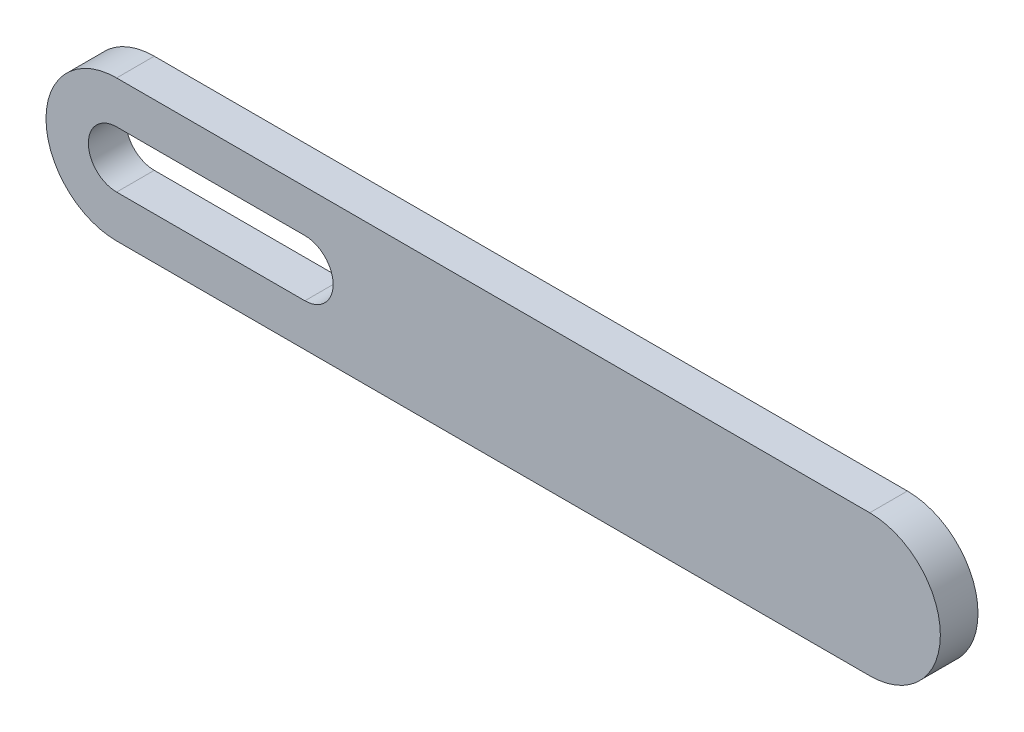
ISO-10303-21;
HEADER;
FILE_DESCRIPTION(('STEP AP214'),'2;1');
FILE_NAME('part.step','',(''),(''),'','','');
FILE_SCHEMA(('AUTOMOTIVE_DESIGN { 1 0 10303 214 1 1 1 1 }'));
ENDSEC;
DATA;
#1=APPLICATION_CONTEXT('core data for automotive mechanical design processes');
#2=APPLICATION_PROTOCOL_DEFINITION('international standard','automotive_design',2000,#1);
#3=PRODUCT_CONTEXT('',#1,'mechanical');
#4=PRODUCT('Part','Part','',(#3));
#5=PRODUCT_RELATED_PRODUCT_CATEGORY('part','',(#4));
#6=PRODUCT_DEFINITION_FORMATION('','',#4);
#7=PRODUCT_DEFINITION_CONTEXT('part definition',#1,'design');
#8=PRODUCT_DEFINITION('design','',#6,#7);
#9=PRODUCT_DEFINITION_SHAPE('','',#8);
#10=(LENGTH_UNIT() NAMED_UNIT(*) SI_UNIT(.MILLI.,.METRE.));
#11=(NAMED_UNIT(*) PLANE_ANGLE_UNIT() SI_UNIT($,.RADIAN.));
#12=(NAMED_UNIT(*) SI_UNIT($,.STERADIAN.) SOLID_ANGLE_UNIT());
#13=UNCERTAINTY_MEASURE_WITH_UNIT(LENGTH_MEASURE(1.E-05),#10,'distance_accuracy_value','');
#14=(GEOMETRIC_REPRESENTATION_CONTEXT(3) GLOBAL_UNCERTAINTY_ASSIGNED_CONTEXT((#13)) GLOBAL_UNIT_ASSIGNED_CONTEXT((#10,
#11,#12)) REPRESENTATION_CONTEXT('',''));
#15=CARTESIAN_POINT('',(0.,0.,0.));
#16=DIRECTION('',(0.,0.,1.));
#17=DIRECTION('',(1.,0.,0.));
#18=AXIS2_PLACEMENT_3D('',#15,#16,#17);
#19=CARTESIAN_POINT('',(-200.,0.,20.));
#20=DIRECTION('',(0.,0.,1.));
#21=DIRECTION('',(1.,0.,0.));
#22=AXIS2_PLACEMENT_3D('',#19,#20,#21);
#23=PLANE('',#22);
#24=CARTESIAN_POINT('',(-200.,0.,20.));
#25=DIRECTION('',(0.,0.,1.));
#26=DIRECTION('',(1.,0.,0.));
#27=AXIS2_PLACEMENT_3D('',#24,#25,#26);
#28=CIRCLE('',#27,37.5);
#29=CARTESIAN_POINT('',(-200.,37.5,20.));
#30=VERTEX_POINT('',#29);
#31=CARTESIAN_POINT('',(-200.,-37.5,20.));
#32=VERTEX_POINT('',#31);
#33=EDGE_CURVE('E138',#30,#32,#28,.T.);
#34=ORIENTED_EDGE('',*,*,#33,.T.);
#35=DIRECTION('',(1.,0.,0.));
#36=VECTOR('',#35,1.);
#37=CARTESIAN_POINT('',(-200.,-37.5,20.));
#38=LINE('',#37,#36);
#39=CARTESIAN_POINT('',(200.,-37.5,20.));
#40=VERTEX_POINT('',#39);
#41=EDGE_CURVE('E141',#32,#40,#38,.T.);
#42=ORIENTED_EDGE('',*,*,#41,.T.);
#43=CARTESIAN_POINT('',(200.,0.,20.));
#44=DIRECTION('',(0.,0.,1.));
#45=DIRECTION('',(1.,0.,0.));
#46=AXIS2_PLACEMENT_3D('',#43,#44,#45);
#47=CIRCLE('',#46,37.5);
#48=CARTESIAN_POINT('',(200.,37.5,20.));
#49=VERTEX_POINT('',#48);
#50=EDGE_CURVE('E144',#40,#49,#47,.T.);
#51=ORIENTED_EDGE('',*,*,#50,.T.);
#52=DIRECTION('',(-1.,0.,0.));
#53=VECTOR('',#52,1.);
#54=CARTESIAN_POINT('',(-200.,37.5,20.));
#55=LINE('',#54,#53);
#56=EDGE_CURVE('E146',#49,#30,#55,.T.);
#57=ORIENTED_EDGE('',*,*,#56,.T.);
#58=EDGE_LOOP('',(#34,#42,#51,#57));
#59=FACE_BOUND('',#58,.T.);
#60=DIRECTION('',(1.,0.,0.));
#61=VECTOR('',#60,1.);
#62=CARTESIAN_POINT('',(-200.,-15.,20.));
#63=LINE('',#62,#61);
#64=CARTESIAN_POINT('',(-200.,-15.,20.));
#65=VERTEX_POINT('',#64);
#66=CARTESIAN_POINT('',(-99.9999999999999,-15.,20.));
#67=VERTEX_POINT('',#66);
#68=EDGE_CURVE('E110',#65,#67,#63,.T.);
#69=ORIENTED_EDGE('',*,*,#68,.F.);
#70=CARTESIAN_POINT('',(-200.,0.,20.));
#71=DIRECTION('',(0.,0.,1.));
#72=DIRECTION('',(1.,0.,0.));
#73=AXIS2_PLACEMENT_3D('',#70,#71,#72);
#74=CIRCLE('',#73,15.);
#75=CARTESIAN_POINT('',(-200.,15.,20.));
#76=VERTEX_POINT('',#75);
#77=EDGE_CURVE('E102',#76,#65,#74,.T.);
#78=ORIENTED_EDGE('',*,*,#77,.F.);
#79=DIRECTION('',(-1.,0.,0.));
#80=VECTOR('',#79,1.);
#81=CARTESIAN_POINT('',(-200.,15.,20.));
#82=LINE('',#81,#80);
#83=CARTESIAN_POINT('',(-99.9999999999999,15.,20.));
#84=VERTEX_POINT('',#83);
#85=EDGE_CURVE('E124',#84,#76,#82,.T.);
#86=ORIENTED_EDGE('',*,*,#85,.F.);
#87=CARTESIAN_POINT('',(-99.9999999999999,0.,20.));
#88=DIRECTION('',(0.,0.,1.));
#89=DIRECTION('',(1.,0.,0.));
#90=AXIS2_PLACEMENT_3D('',#87,#88,#89);
#91=CIRCLE('',#90,15.);
#92=EDGE_CURVE('E122',#67,#84,#91,.T.);
#93=ORIENTED_EDGE('',*,*,#92,.F.);
#94=EDGE_LOOP('',(#69,#78,#86,#93));
#95=FACE_BOUND('',#94,.T.);
#96=ADVANCED_FACE('F37',(#59,#95),#23,.T.);
#97=CARTESIAN_POINT('',(-200.,0.,0.));
#98=DIRECTION('',(0.,0.,1.));
#99=DIRECTION('',(1.,0.,0.));
#100=AXIS2_PLACEMENT_3D('',#97,#98,#99);
#101=PLANE('',#100);
#102=CARTESIAN_POINT('',(-200.,0.,0.));
#103=DIRECTION('',(0.,0.,1.));
#104=DIRECTION('',(1.,0.,0.));
#105=AXIS2_PLACEMENT_3D('',#102,#103,#104);
#106=CIRCLE('',#105,37.5);
#107=CARTESIAN_POINT('',(-200.,37.5,0.));
#108=VERTEX_POINT('',#107);
#109=CARTESIAN_POINT('',(-200.,-37.5,0.));
#110=VERTEX_POINT('',#109);
#111=EDGE_CURVE('E118',#108,#110,#106,.T.);
#112=ORIENTED_EDGE('',*,*,#111,.F.);
#113=DIRECTION('',(-1.,0.,0.));
#114=VECTOR('',#113,1.);
#115=CARTESIAN_POINT('',(-200.,37.5,0.));
#116=LINE('',#115,#114);
#117=CARTESIAN_POINT('',(200.,37.5,0.));
#118=VERTEX_POINT('',#117);
#119=EDGE_CURVE('E142',#118,#108,#116,.T.);
#120=ORIENTED_EDGE('',*,*,#119,.F.);
#121=CARTESIAN_POINT('',(200.,0.,0.));
#122=DIRECTION('',(0.,0.,1.));
#123=DIRECTION('',(1.,0.,0.));
#124=AXIS2_PLACEMENT_3D('',#121,#122,#123);
#125=CIRCLE('',#124,37.5);
#126=CARTESIAN_POINT('',(200.,-37.5,0.));
#127=VERTEX_POINT('',#126);
#128=EDGE_CURVE('E153',#127,#118,#125,.T.);
#129=ORIENTED_EDGE('',*,*,#128,.F.);
#130=DIRECTION('',(1.,0.,0.));
#131=VECTOR('',#130,1.);
#132=CARTESIAN_POINT('',(-200.,-37.5,0.));
#133=LINE('',#132,#131);
#134=EDGE_CURVE('E151',#110,#127,#133,.T.);
#135=ORIENTED_EDGE('',*,*,#134,.F.);
#136=EDGE_LOOP('',(#112,#120,#129,#135));
#137=FACE_BOUND('',#136,.T.);
#138=CARTESIAN_POINT('',(-200.,0.,0.));
#139=DIRECTION('',(0.,0.,1.));
#140=DIRECTION('',(1.,0.,0.));
#141=AXIS2_PLACEMENT_3D('',#138,#139,#140);
#142=CIRCLE('',#141,15.);
#143=CARTESIAN_POINT('',(-200.,15.,0.));
#144=VERTEX_POINT('',#143);
#145=CARTESIAN_POINT('',(-200.,-15.,0.));
#146=VERTEX_POINT('',#145);
#147=EDGE_CURVE('E60',#144,#146,#142,.T.);
#148=ORIENTED_EDGE('',*,*,#147,.T.);
#149=DIRECTION('',(1.,0.,0.));
#150=VECTOR('',#149,1.);
#151=CARTESIAN_POINT('',(-200.,-15.,0.));
#152=LINE('',#151,#150);
#153=CARTESIAN_POINT('',(-99.9999999999999,-15.,0.));
#154=VERTEX_POINT('',#153);
#155=EDGE_CURVE('E117',#146,#154,#152,.T.);
#156=ORIENTED_EDGE('',*,*,#155,.T.);
#157=CARTESIAN_POINT('',(-99.9999999999999,0.,0.));
#158=DIRECTION('',(0.,0.,1.));
#159=DIRECTION('',(1.,0.,0.));
#160=AXIS2_PLACEMENT_3D('',#157,#158,#159);
#161=CIRCLE('',#160,15.);
#162=CARTESIAN_POINT('',(-99.9999999999999,15.,0.));
#163=VERTEX_POINT('',#162);
#164=EDGE_CURVE('E130',#154,#163,#161,.T.);
#165=ORIENTED_EDGE('',*,*,#164,.T.);
#166=DIRECTION('',(-1.,0.,0.));
#167=VECTOR('',#166,1.);
#168=CARTESIAN_POINT('',(-200.,15.,0.));
#169=LINE('',#168,#167);
#170=EDGE_CURVE('E111',#163,#144,#169,.T.);
#171=ORIENTED_EDGE('',*,*,#170,.T.);
#172=EDGE_LOOP('',(#148,#156,#165,#171));
#173=FACE_BOUND('',#172,.T.);
#174=ADVANCED_FACE('F171',(#137,#173),#101,.F.);
#175=CARTESIAN_POINT('',(-200.,0.,20.));
#176=DIRECTION('',(0.,0.,-1.));
#177=DIRECTION('',(-1.,0.,0.));
#178=AXIS2_PLACEMENT_3D('',#175,#176,#177);
#179=CYLINDRICAL_SURFACE('',#178,37.5);
#180=ORIENTED_EDGE('',*,*,#111,.T.);
#181=DIRECTION('',(0.,0.,-1.));
#182=VECTOR('',#181,1.);
#183=CARTESIAN_POINT('',(-200.,-37.5,20.));
#184=LINE('',#183,#182);
#185=EDGE_CURVE('E11',#32,#110,#184,.T.);
#186=ORIENTED_EDGE('',*,*,#185,.F.);
#187=ORIENTED_EDGE('',*,*,#33,.F.);
#188=DIRECTION('',(0.,0.,-1.));
#189=VECTOR('',#188,1.);
#190=CARTESIAN_POINT('',(-200.,37.5,20.));
#191=LINE('',#190,#189);
#192=EDGE_CURVE('E148',#30,#108,#191,.T.);
#193=ORIENTED_EDGE('',*,*,#192,.T.);
#194=EDGE_LOOP('',(#180,#186,#187,#193));
#195=FACE_BOUND('',#194,.T.);
#196=ADVANCED_FACE('F39',(#195),#179,.T.);
#197=CARTESIAN_POINT('',(-200.,-37.5,20.));
#198=DIRECTION('',(0.,1.,0.));
#199=DIRECTION('',(0.,0.,1.));
#200=AXIS2_PLACEMENT_3D('',#197,#198,#199);
#201=PLANE('',#200);
#202=ORIENTED_EDGE('',*,*,#134,.T.);
#203=DIRECTION('',(0.,0.,-1.));
#204=VECTOR('',#203,1.);
#205=CARTESIAN_POINT('',(200.,-37.5,20.));
#206=LINE('',#205,#204);
#207=EDGE_CURVE('E45',#40,#127,#206,.T.);
#208=ORIENTED_EDGE('',*,*,#207,.F.);
#209=ORIENTED_EDGE('',*,*,#41,.F.);
#210=ORIENTED_EDGE('',*,*,#185,.T.);
#211=EDGE_LOOP('',(#202,#208,#209,#210));
#212=FACE_BOUND('',#211,.T.);
#213=ADVANCED_FACE('F181',(#212),#201,.F.);
#214=CARTESIAN_POINT('',(200.,0.,20.));
#215=DIRECTION('',(0.,0.,-1.));
#216=DIRECTION('',(-1.,0.,0.));
#217=AXIS2_PLACEMENT_3D('',#214,#215,#216);
#218=CYLINDRICAL_SURFACE('',#217,37.5);
#219=ORIENTED_EDGE('',*,*,#128,.T.);
#220=DIRECTION('',(0.,0.,-1.));
#221=VECTOR('',#220,1.);
#222=CARTESIAN_POINT('',(200.,37.5,20.));
#223=LINE('',#222,#221);
#224=EDGE_CURVE('E158',#49,#118,#223,.T.);
#225=ORIENTED_EDGE('',*,*,#224,.F.);
#226=ORIENTED_EDGE('',*,*,#50,.F.);
#227=ORIENTED_EDGE('',*,*,#207,.T.);
#228=EDGE_LOOP('',(#219,#225,#226,#227));
#229=FACE_BOUND('',#228,.T.);
#230=ADVANCED_FACE('F165',(#229),#218,.T.);
#231=CARTESIAN_POINT('',(-200.,37.5,20.));
#232=DIRECTION('',(0.,-1.,0.));
#233=DIRECTION('',(0.,0.,-1.));
#234=AXIS2_PLACEMENT_3D('',#231,#232,#233);
#235=PLANE('',#234);
#236=ORIENTED_EDGE('',*,*,#119,.T.);
#237=ORIENTED_EDGE('',*,*,#192,.F.);
#238=ORIENTED_EDGE('',*,*,#56,.F.);
#239=ORIENTED_EDGE('',*,*,#224,.T.);
#240=EDGE_LOOP('',(#236,#237,#238,#239));
#241=FACE_BOUND('',#240,.T.);
#242=ADVANCED_FACE('F175',(#241),#235,.F.);
#243=CARTESIAN_POINT('',(-200.,0.,20.));
#244=DIRECTION('',(0.,0.,-1.));
#245=DIRECTION('',(-1.,0.,0.));
#246=AXIS2_PLACEMENT_3D('',#243,#244,#245);
#247=CYLINDRICAL_SURFACE('',#246,15.);
#248=ORIENTED_EDGE('',*,*,#147,.F.);
#249=DIRECTION('',(0.,0.,-1.));
#250=VECTOR('',#249,1.);
#251=CARTESIAN_POINT('',(-200.,15.,20.));
#252=LINE('',#251,#250);
#253=EDGE_CURVE('E106',#76,#144,#252,.T.);
#254=ORIENTED_EDGE('',*,*,#253,.F.);
#255=ORIENTED_EDGE('',*,*,#77,.T.);
#256=DIRECTION('',(0.,0.,-1.));
#257=VECTOR('',#256,1.);
#258=CARTESIAN_POINT('',(-200.,-15.,20.));
#259=LINE('',#258,#257);
#260=EDGE_CURVE('E105',#65,#146,#259,.T.);
#261=ORIENTED_EDGE('',*,*,#260,.T.);
#262=EDGE_LOOP('',(#248,#254,#255,#261));
#263=FACE_BOUND('',#262,.T.);
#264=ADVANCED_FACE('F104',(#263),#247,.F.);
#265=CARTESIAN_POINT('',(-200.,-15.,20.));
#266=DIRECTION('',(0.,1.,0.));
#267=DIRECTION('',(0.,0.,1.));
#268=AXIS2_PLACEMENT_3D('',#265,#266,#267);
#269=PLANE('',#268);
#270=ORIENTED_EDGE('',*,*,#155,.F.);
#271=ORIENTED_EDGE('',*,*,#260,.F.);
#272=ORIENTED_EDGE('',*,*,#68,.T.);
#273=DIRECTION('',(0.,0.,-1.));
#274=VECTOR('',#273,1.);
#275=CARTESIAN_POINT('',(-99.9999999999999,-15.,20.));
#276=LINE('',#275,#274);
#277=EDGE_CURVE('E119',#67,#154,#276,.T.);
#278=ORIENTED_EDGE('',*,*,#277,.T.);
#279=EDGE_LOOP('',(#270,#271,#272,#278));
#280=FACE_BOUND('',#279,.T.);
#281=ADVANCED_FACE('F114',(#280),#269,.T.);
#282=CARTESIAN_POINT('',(-99.9999999999999,0.,20.));
#283=DIRECTION('',(0.,0.,-1.));
#284=DIRECTION('',(-1.,0.,0.));
#285=AXIS2_PLACEMENT_3D('',#282,#283,#284);
#286=CYLINDRICAL_SURFACE('',#285,15.);
#287=ORIENTED_EDGE('',*,*,#164,.F.);
#288=ORIENTED_EDGE('',*,*,#277,.F.);
#289=ORIENTED_EDGE('',*,*,#92,.T.);
#290=DIRECTION('',(0.,0.,-1.));
#291=VECTOR('',#290,1.);
#292=CARTESIAN_POINT('',(-99.9999999999999,15.,20.));
#293=LINE('',#292,#291);
#294=EDGE_CURVE('E52',#84,#163,#293,.T.);
#295=ORIENTED_EDGE('',*,*,#294,.T.);
#296=EDGE_LOOP('',(#287,#288,#289,#295));
#297=FACE_BOUND('',#296,.T.);
#298=ADVANCED_FACE('F204',(#297),#286,.F.);
#299=CARTESIAN_POINT('',(-200.,15.,20.));
#300=DIRECTION('',(0.,-1.,0.));
#301=DIRECTION('',(0.,0.,-1.));
#302=AXIS2_PLACEMENT_3D('',#299,#300,#301);
#303=PLANE('',#302);
#304=ORIENTED_EDGE('',*,*,#170,.F.);
#305=ORIENTED_EDGE('',*,*,#294,.F.);
#306=ORIENTED_EDGE('',*,*,#85,.T.);
#307=ORIENTED_EDGE('',*,*,#253,.T.);
#308=EDGE_LOOP('',(#304,#305,#306,#307));
#309=FACE_BOUND('',#308,.T.);
#310=ADVANCED_FACE('F208',(#309),#303,.T.);
#311=CLOSED_SHELL('',(#96,#174,#196,#213,#230,#242,#264,#281,#298,#310));
#312=MANIFOLD_SOLID_BREP('B2',#311);
#313=ADVANCED_BREP_SHAPE_REPRESENTATION('',(#18,#312),#14);
#314=SHAPE_DEFINITION_REPRESENTATION(#9,#313);
ENDSEC;
END-ISO-10303-21;
